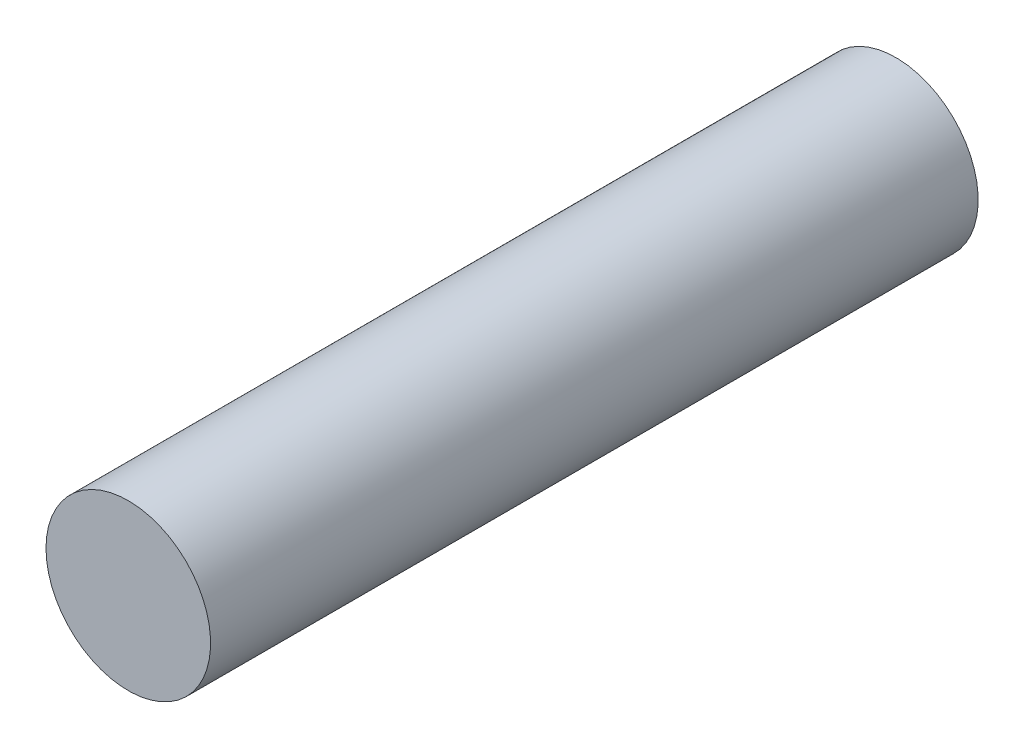
ISO-10303-21;
HEADER;
FILE_DESCRIPTION(('STEP AP214'),'2;1');
FILE_NAME('part.step','',(''),(''),'','','');
FILE_SCHEMA(('AUTOMOTIVE_DESIGN { 1 0 10303 214 1 1 1 1 }'));
ENDSEC;
DATA;
#1=APPLICATION_CONTEXT('core data for automotive mechanical design processes');
#2=APPLICATION_PROTOCOL_DEFINITION('international standard','automotive_design',2000,#1);
#3=PRODUCT_CONTEXT('',#1,'mechanical');
#4=PRODUCT('Part','Part','',(#3));
#5=PRODUCT_RELATED_PRODUCT_CATEGORY('part','',(#4));
#6=PRODUCT_DEFINITION_FORMATION('','',#4);
#7=PRODUCT_DEFINITION_CONTEXT('part definition',#1,'design');
#8=PRODUCT_DEFINITION('design','',#6,#7);
#9=PRODUCT_DEFINITION_SHAPE('','',#8);
#10=(LENGTH_UNIT() NAMED_UNIT(*) SI_UNIT(.MILLI.,.METRE.));
#11=(NAMED_UNIT(*) PLANE_ANGLE_UNIT() SI_UNIT($,.RADIAN.));
#12=(NAMED_UNIT(*) SI_UNIT($,.STERADIAN.) SOLID_ANGLE_UNIT());
#13=UNCERTAINTY_MEASURE_WITH_UNIT(LENGTH_MEASURE(1.E-05),#10,'distance_accuracy_value','');
#14=(GEOMETRIC_REPRESENTATION_CONTEXT(3) GLOBAL_UNCERTAINTY_ASSIGNED_CONTEXT((#13)) GLOBAL_UNIT_ASSIGNED_CONTEXT((#10,
#11,#12)) REPRESENTATION_CONTEXT('',''));
#15=CARTESIAN_POINT('',(0.,0.,0.));
#16=DIRECTION('',(0.,0.,1.));
#17=DIRECTION('',(1.,0.,0.));
#18=AXIS2_PLACEMENT_3D('',#15,#16,#17);
#19=CARTESIAN_POINT('',(0.,0.,112.5));
#20=DIRECTION('',(0.,0.,-1.));
#21=DIRECTION('',(-1.,0.,0.));
#22=AXIS2_PLACEMENT_3D('',#19,#20,#21);
#23=CYLINDRICAL_SURFACE('',#22,14.475);
#24=CARTESIAN_POINT('',(0.,0.,112.5));
#25=DIRECTION('',(0.,0.,1.));
#26=DIRECTION('',(1.,0.,0.));
#27=AXIS2_PLACEMENT_3D('',#24,#25,#26);
#28=CIRCLE('',#27,14.475);
#29=CARTESIAN_POINT('',(-14.475,0.,112.5));
#30=VERTEX_POINT('',#29);
#31=EDGE_CURVE('E10',#30,#30,#28,.T.);
#32=CARTESIAN_POINT('',(0.,0.,-22.5));
#33=DIRECTION('',(0.,0.,1.));
#34=DIRECTION('',(1.,0.,0.));
#35=AXIS2_PLACEMENT_3D('',#32,#33,#34);
#36=CIRCLE('',#35,14.475);
#37=CARTESIAN_POINT('',(-14.475,0.,-22.5));
#38=VERTEX_POINT('',#37);
#39=EDGE_CURVE('E35',#38,#38,#36,.T.);
#40=CARTESIAN_POINT('',(-14.475,0.,112.5));
#41=CARTESIAN_POINT('',(-14.475,0.,111.09375));
#42=CARTESIAN_POINT('',(-14.475,0.,109.6875));
#43=CARTESIAN_POINT('',(-14.475,0.,106.875));
#44=CARTESIAN_POINT('',(-14.475,0.,105.46875));
#45=CARTESIAN_POINT('',(-14.475,0.,102.65625));
#46=CARTESIAN_POINT('',(-14.475,0.,101.25));
#47=CARTESIAN_POINT('',(-14.475,0.,98.4375));
#48=CARTESIAN_POINT('',(-14.475,0.,97.03125));
#49=CARTESIAN_POINT('',(-14.475,0.,94.21875));
#50=CARTESIAN_POINT('',(-14.475,0.,92.8125));
#51=CARTESIAN_POINT('',(-14.475,0.,90.));
#52=CARTESIAN_POINT('',(-14.475,0.,88.59375));
#53=CARTESIAN_POINT('',(-14.475,0.,85.78125));
#54=CARTESIAN_POINT('',(-14.475,0.,84.375));
#55=CARTESIAN_POINT('',(-14.475,0.,81.5625));
#56=CARTESIAN_POINT('',(-14.475,0.,80.15625));
#57=CARTESIAN_POINT('',(-14.475,0.,77.34375));
#58=CARTESIAN_POINT('',(-14.475,0.,75.9375));
#59=CARTESIAN_POINT('',(-14.475,0.,73.125));
#60=CARTESIAN_POINT('',(-14.475,0.,71.71875));
#61=CARTESIAN_POINT('',(-14.475,0.,68.90625));
#62=CARTESIAN_POINT('',(-14.475,0.,67.5));
#63=CARTESIAN_POINT('',(-14.475,0.,64.6875));
#64=CARTESIAN_POINT('',(-14.475,0.,63.28125));
#65=CARTESIAN_POINT('',(-14.475,0.,60.46875));
#66=CARTESIAN_POINT('',(-14.475,0.,59.0625));
#67=CARTESIAN_POINT('',(-14.475,0.,56.25));
#68=CARTESIAN_POINT('',(-14.475,0.,54.84375));
#69=CARTESIAN_POINT('',(-14.475,0.,52.03125));
#70=CARTESIAN_POINT('',(-14.475,0.,50.625));
#71=CARTESIAN_POINT('',(-14.475,0.,47.8125));
#72=CARTESIAN_POINT('',(-14.475,0.,46.40625));
#73=CARTESIAN_POINT('',(-14.475,0.,43.59375));
#74=CARTESIAN_POINT('',(-14.475,0.,42.1875));
#75=CARTESIAN_POINT('',(-14.475,0.,39.375));
#76=CARTESIAN_POINT('',(-14.475,0.,37.96875));
#77=CARTESIAN_POINT('',(-14.475,0.,35.15625));
#78=CARTESIAN_POINT('',(-14.475,0.,33.75));
#79=CARTESIAN_POINT('',(-14.475,0.,30.9375));
#80=CARTESIAN_POINT('',(-14.475,0.,29.53125));
#81=CARTESIAN_POINT('',(-14.475,0.,26.71875));
#82=CARTESIAN_POINT('',(-14.475,0.,25.3125));
#83=CARTESIAN_POINT('',(-14.475,0.,22.5));
#84=CARTESIAN_POINT('',(-14.475,0.,21.09375));
#85=CARTESIAN_POINT('',(-14.475,0.,18.28125));
#86=CARTESIAN_POINT('',(-14.475,0.,16.875));
#87=CARTESIAN_POINT('',(-14.475,0.,14.0625));
#88=CARTESIAN_POINT('',(-14.475,0.,12.65625));
#89=CARTESIAN_POINT('',(-14.475,0.,9.84374999999998));
#90=CARTESIAN_POINT('',(-14.475,0.,8.43749999999999));
#91=CARTESIAN_POINT('',(-14.475,0.,5.62499999999999));
#92=CARTESIAN_POINT('',(-14.475,0.,4.21874999999998));
#93=CARTESIAN_POINT('',(-14.475,0.,1.40624999999998));
#94=CARTESIAN_POINT('',(-14.475,0.,0.));
#95=CARTESIAN_POINT('',(-14.475,0.,-2.81250000000002));
#96=CARTESIAN_POINT('',(-14.475,0.,-4.21875000000002));
#97=CARTESIAN_POINT('',(-14.475,0.,-7.03125000000002));
#98=CARTESIAN_POINT('',(-14.475,0.,-8.43750000000001));
#99=CARTESIAN_POINT('',(-14.475,0.,-11.25));
#100=CARTESIAN_POINT('',(-14.475,0.,-12.65625));
#101=CARTESIAN_POINT('',(-14.475,0.,-15.46875));
#102=CARTESIAN_POINT('',(-14.475,0.,-16.875));
#103=CARTESIAN_POINT('',(-14.475,0.,-19.6875));
#104=CARTESIAN_POINT('',(-14.475,0.,-21.09375));
#105=CARTESIAN_POINT('',(-14.475,0.,-22.5));
#106=B_SPLINE_CURVE_WITH_KNOTS('',3,(#40,#41,#42,#43,#44,#45,#46,#47,#48,#49,#50,#51,#52,#53,
#54,#55,#56,#57,#58,#59,#60,#61,#62,#63,#64,#65,#66,#67,#68,#69,#70,#71,#72,#73,#74,#75,#76,#77,
#78,#79,#80,#81,#82,#83,#84,#85,#86,#87,#88,#89,#90,#91,#92,#93,#94,#95,#96,#97,#98,#99,#100,
#101,#102,#103,#104,#105),.UNSPECIFIED.,.F.,.F.,(4,2,2,2,2,2,2,2,2,2,2,2,2,2,2,2,2,2,2,2,2,2,2,
2,2,2,2,2,2,2,2,2,4),(0.,4.21874999999999,8.43749999999999,12.65625,16.875,21.09375,25.3125,
29.53125,33.75,37.96875,42.1875,46.40625,50.625,54.84375,59.0625,63.28125,67.5,71.71875,75.9375,
80.15625,84.375,88.59375,92.8125,97.03125,101.25,105.46875,109.6875,113.90625,118.125,122.34375,
126.5625,130.78125,135.),.UNSPECIFIED.);
#107=EDGE_CURVE('BSEAM32',#30,#38,#106,.T.);
#108=ORIENTED_EDGE('',*,*,#31,.F.);
#109=ORIENTED_EDGE('',*,*,#39,.T.);
#110=ORIENTED_EDGE('',*,*,#107,.T.);
#111=ORIENTED_EDGE('',*,*,#107,.F.);
#112=EDGE_LOOP('',(#108,#110,#109,#111));
#113=FACE_BOUND('',#112,.T.);
#114=ADVANCED_FACE('F32',(#113),#23,.T.);
#115=CARTESIAN_POINT('',(0.,0.,112.5));
#116=DIRECTION('',(0.,0.,1.));
#117=DIRECTION('',(1.,0.,0.));
#118=AXIS2_PLACEMENT_3D('',#115,#116,#117);
#119=PLANE('',#118);
#120=ORIENTED_EDGE('',*,*,#31,.T.);
#121=EDGE_LOOP('',(#120));
#122=FACE_BOUND('',#121,.T.);
#123=ADVANCED_FACE('F47',(#122),#119,.T.);
#124=CARTESIAN_POINT('',(0.,0.,-22.5));
#125=DIRECTION('',(0.,0.,1.));
#126=DIRECTION('',(1.,0.,0.));
#127=AXIS2_PLACEMENT_3D('',#124,#125,#126);
#128=PLANE('',#127);
#129=ORIENTED_EDGE('',*,*,#39,.F.);
#130=EDGE_LOOP('',(#129));
#131=FACE_BOUND('',#130,.T.);
#132=ADVANCED_FACE('F45',(#131),#128,.F.);
#133=CLOSED_SHELL('',(#114,#123,#132));
#134=MANIFOLD_SOLID_BREP('B2',#133);
#135=ADVANCED_BREP_SHAPE_REPRESENTATION('',(#18,#134),#14);
#136=SHAPE_DEFINITION_REPRESENTATION(#9,#135);
ENDSEC;
END-ISO-10303-21;
